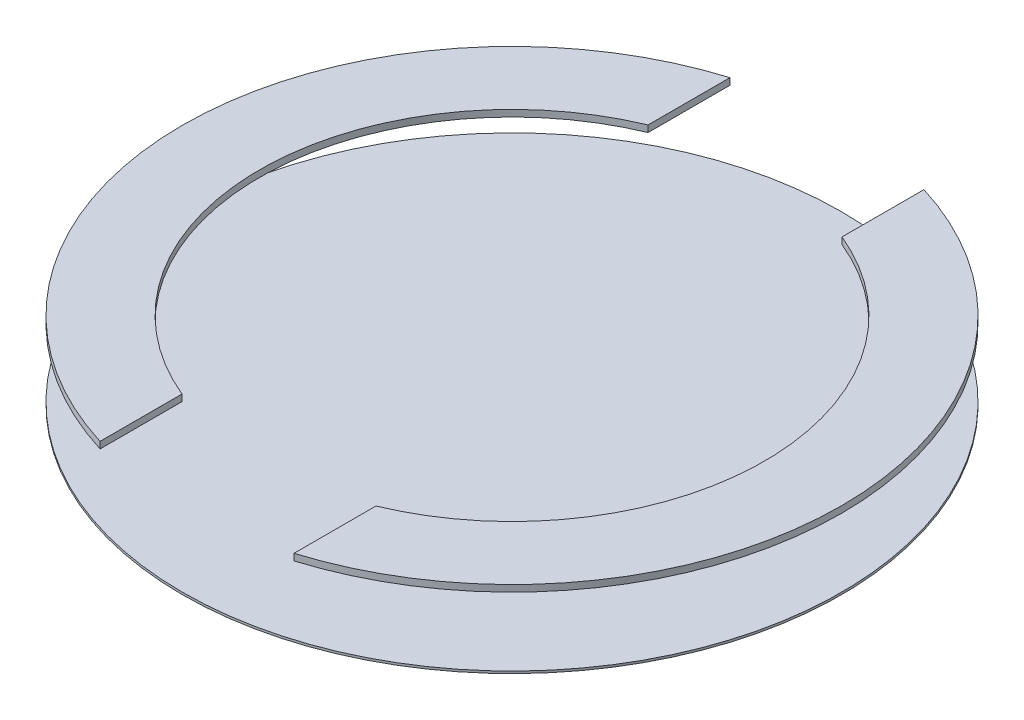
ISO-10303-21;
HEADER;
FILE_DESCRIPTION(('STEP AP214'),'2;1');
FILE_NAME('part.step','',(''),(''),'','','');
FILE_SCHEMA(('AUTOMOTIVE_DESIGN { 1 0 10303 214 1 1 1 1 }'));
ENDSEC;
DATA;
#1=APPLICATION_CONTEXT('core data for automotive mechanical design processes');
#2=APPLICATION_PROTOCOL_DEFINITION('international standard','automotive_design',2000,#1);
#3=PRODUCT_CONTEXT('',#1,'mechanical');
#4=PRODUCT('Part','Part','',(#3));
#5=PRODUCT_RELATED_PRODUCT_CATEGORY('part','',(#4));
#6=PRODUCT_DEFINITION_FORMATION('','',#4);
#7=PRODUCT_DEFINITION_CONTEXT('part definition',#1,'design');
#8=PRODUCT_DEFINITION('design','',#6,#7);
#9=PRODUCT_DEFINITION_SHAPE('','',#8);
#10=(LENGTH_UNIT() NAMED_UNIT(*) SI_UNIT(.MILLI.,.METRE.));
#11=(NAMED_UNIT(*) PLANE_ANGLE_UNIT() SI_UNIT($,.RADIAN.));
#12=(NAMED_UNIT(*) SI_UNIT($,.STERADIAN.) SOLID_ANGLE_UNIT());
#13=UNCERTAINTY_MEASURE_WITH_UNIT(LENGTH_MEASURE(1.E-05),#10,'distance_accuracy_value','');
#14=(GEOMETRIC_REPRESENTATION_CONTEXT(3) GLOBAL_UNCERTAINTY_ASSIGNED_CONTEXT((#13)) GLOBAL_UNIT_ASSIGNED_CONTEXT((#10,
#11,#12)) REPRESENTATION_CONTEXT('',''));
#15=CARTESIAN_POINT('',(0.,0.,0.));
#16=DIRECTION('',(0.,0.,1.));
#17=DIRECTION('',(1.,0.,0.));
#18=AXIS2_PLACEMENT_3D('',#15,#16,#17);
#19=CARTESIAN_POINT('',(440.104013269853,650.,0.));
#20=DIRECTION('',(-1.,0.,0.));
#21=DIRECTION('',(0.,0.,1.));
#22=AXIS2_PLACEMENT_3D('',#19,#20,#21);
#23=PLANE('',#22);
#24=DIRECTION('',(0.,-1.,0.));
#25=VECTOR('',#24,1.);
#26=CARTESIAN_POINT('',(440.104013269853,650.,-1429.31744168459));
#27=LINE('',#26,#25);
#28=CARTESIAN_POINT('',(440.104013269853,340.,-1429.31744168459));
#29=VERTEX_POINT('',#28);
#30=CARTESIAN_POINT('',(440.104013269853,310.,-1429.31744168459));
#31=VERTEX_POINT('',#30);
#32=EDGE_CURVE('E102',#29,#31,#27,.T.);
#33=ORIENTED_EDGE('',*,*,#32,.T.);
#34=DIRECTION('',(0.,0.,1.));
#35=VECTOR('',#34,1.);
#36=CARTESIAN_POINT('',(440.104013269853,310.,0.));
#37=LINE('',#36,#35);
#38=CARTESIAN_POINT('',(440.104013269853,310.,-1057.50647553573));
#39=VERTEX_POINT('',#38);
#40=EDGE_CURVE('E63',#31,#39,#37,.T.);
#41=ORIENTED_EDGE('',*,*,#40,.T.);
#42=DIRECTION('',(0.,-1.,0.));
#43=VECTOR('',#42,1.);
#44=CARTESIAN_POINT('',(440.104013269853,650.,-1057.50647553573));
#45=LINE('',#44,#43);
#46=CARTESIAN_POINT('',(440.104013269853,340.,-1057.50647553573));
#47=VERTEX_POINT('',#46);
#48=EDGE_CURVE('E95',#47,#39,#45,.T.);
#49=ORIENTED_EDGE('',*,*,#48,.F.);
#50=DIRECTION('',(0.,0.,1.));
#51=VECTOR('',#50,1.);
#52=CARTESIAN_POINT('',(440.104013269853,340.,0.));
#53=LINE('',#52,#51);
#54=EDGE_CURVE('E105',#29,#47,#53,.T.);
#55=ORIENTED_EDGE('',*,*,#54,.F.);
#56=EDGE_LOOP('',(#33,#41,#49,#55));
#57=FACE_BOUND('',#56,.T.);
#58=ADVANCED_FACE('F46',(#57),#23,.T.);
#59=CARTESIAN_POINT('',(0.,650.,0.));
#60=DIRECTION('',(0.,-1.,0.));
#61=DIRECTION('',(0.,0.,-1.));
#62=AXIS2_PLACEMENT_3D('',#59,#60,#61);
#63=CYLINDRICAL_SURFACE('',#62,1145.43069990997);
#64=CARTESIAN_POINT('',(0.,310.,0.));
#65=DIRECTION('',(0.,-1.,0.));
#66=DIRECTION('',(0.,0.,-1.));
#67=AXIS2_PLACEMENT_3D('',#64,#65,#66);
#68=CIRCLE('',#67,1145.43069990997);
#69=CARTESIAN_POINT('',(440.104013269853,310.,1057.50647553573));
#70=VERTEX_POINT('',#69);
#71=EDGE_CURVE('E12',#70,#39,#68,.F.);
#72=ORIENTED_EDGE('',*,*,#71,.F.);
#73=DIRECTION('',(0.,-1.,0.));
#74=VECTOR('',#73,1.);
#75=CARTESIAN_POINT('',(440.104013269853,650.,1057.50647553573));
#76=LINE('',#75,#74);
#77=CARTESIAN_POINT('',(440.104013269853,340.,1057.50647553573));
#78=VERTEX_POINT('',#77);
#79=EDGE_CURVE('E94',#78,#70,#76,.T.);
#80=ORIENTED_EDGE('',*,*,#79,.F.);
#81=CARTESIAN_POINT('',(0.,340.,0.));
#82=DIRECTION('',(0.,-1.,0.));
#83=DIRECTION('',(0.,0.,-1.));
#84=AXIS2_PLACEMENT_3D('',#81,#82,#83);
#85=CIRCLE('',#84,1145.43069990997);
#86=EDGE_CURVE('E89',#78,#47,#85,.F.);
#87=ORIENTED_EDGE('',*,*,#86,.T.);
#88=ORIENTED_EDGE('',*,*,#48,.T.);
#89=EDGE_LOOP('',(#72,#80,#87,#88));
#90=FACE_BOUND('',#89,.T.);
#91=ADVANCED_FACE('F120',(#90),#63,.F.);
#92=CARTESIAN_POINT('',(440.104013269853,650.,0.));
#93=DIRECTION('',(1.,0.,0.));
#94=DIRECTION('',(0.,0.,-1.));
#95=AXIS2_PLACEMENT_3D('',#92,#93,#94);
#96=PLANE('',#95);
#97=DIRECTION('',(0.,0.,-1.));
#98=VECTOR('',#97,1.);
#99=CARTESIAN_POINT('',(440.104013269853,310.,0.));
#100=LINE('',#99,#98);
#101=CARTESIAN_POINT('',(440.104013269853,310.,1429.31744168459));
#102=VERTEX_POINT('',#101);
#103=EDGE_CURVE('E56',#102,#70,#100,.T.);
#104=ORIENTED_EDGE('',*,*,#103,.F.);
#105=DIRECTION('',(0.,-1.,0.));
#106=VECTOR('',#105,1.);
#107=CARTESIAN_POINT('',(440.104013269853,650.,1429.31744168459));
#108=LINE('',#107,#106);
#109=CARTESIAN_POINT('',(440.104013269853,340.,1429.31744168459));
#110=VERTEX_POINT('',#109);
#111=EDGE_CURVE('E100',#110,#102,#108,.T.);
#112=ORIENTED_EDGE('',*,*,#111,.F.);
#113=DIRECTION('',(0.,0.,-1.));
#114=VECTOR('',#113,1.);
#115=CARTESIAN_POINT('',(440.104013269853,340.,0.));
#116=LINE('',#115,#114);
#117=EDGE_CURVE('E83',#110,#78,#116,.T.);
#118=ORIENTED_EDGE('',*,*,#117,.T.);
#119=ORIENTED_EDGE('',*,*,#79,.T.);
#120=EDGE_LOOP('',(#104,#112,#118,#119));
#121=FACE_BOUND('',#120,.T.);
#122=ADVANCED_FACE('F104',(#121),#96,.F.);
#123=CARTESIAN_POINT('',(0.,650.,0.));
#124=DIRECTION('',(0.,-1.,0.));
#125=DIRECTION('',(0.,0.,-1.));
#126=AXIS2_PLACEMENT_3D('',#123,#124,#125);
#127=CYLINDRICAL_SURFACE('',#126,1495.54);
#128=CARTESIAN_POINT('',(0.,310.,0.));
#129=DIRECTION('',(0.,-1.,0.));
#130=DIRECTION('',(0.,0.,-1.));
#131=AXIS2_PLACEMENT_3D('',#128,#129,#130);
#132=CIRCLE('',#131,1495.54);
#133=EDGE_CURVE('E50',#31,#102,#132,.T.);
#134=ORIENTED_EDGE('',*,*,#133,.F.);
#135=ORIENTED_EDGE('',*,*,#32,.F.);
#136=CARTESIAN_POINT('',(0.,340.,0.));
#137=DIRECTION('',(0.,-1.,0.));
#138=DIRECTION('',(0.,0.,-1.));
#139=AXIS2_PLACEMENT_3D('',#136,#137,#138);
#140=CIRCLE('',#139,1495.54);
#141=EDGE_CURVE('E86',#29,#110,#140,.T.);
#142=ORIENTED_EDGE('',*,*,#141,.T.);
#143=ORIENTED_EDGE('',*,*,#111,.T.);
#144=EDGE_LOOP('',(#134,#135,#142,#143));
#145=FACE_BOUND('',#144,.T.);
#146=ADVANCED_FACE('F48',(#145),#127,.T.);
#147=CARTESIAN_POINT('',(-1495.54,340.,-1495.54));
#148=DIRECTION('',(0.,-1.,0.));
#149=DIRECTION('',(0.,0.,-1.));
#150=AXIS2_PLACEMENT_3D('',#147,#148,#149);
#151=PLANE('',#150);
#152=ORIENTED_EDGE('',*,*,#54,.T.);
#153=ORIENTED_EDGE('',*,*,#86,.F.);
#154=ORIENTED_EDGE('',*,*,#117,.F.);
#155=ORIENTED_EDGE('',*,*,#141,.F.);
#156=EDGE_LOOP('',(#152,#153,#154,#155));
#157=FACE_BOUND('',#156,.T.);
#158=ADVANCED_FACE('F85',(#157),#151,.F.);
#159=CARTESIAN_POINT('',(-1495.54,310.,-1495.54));
#160=DIRECTION('',(0.,-1.,0.));
#161=DIRECTION('',(0.,0.,-1.));
#162=AXIS2_PLACEMENT_3D('',#159,#160,#161);
#163=PLANE('',#162);
#164=ORIENTED_EDGE('',*,*,#133,.T.);
#165=ORIENTED_EDGE('',*,*,#103,.T.);
#166=ORIENTED_EDGE('',*,*,#71,.T.);
#167=ORIENTED_EDGE('',*,*,#40,.F.);
#168=EDGE_LOOP('',(#164,#165,#166,#167));
#169=FACE_BOUND('',#168,.T.);
#170=ADVANCED_FACE('F115',(#169),#163,.T.);
#171=CLOSED_SHELL('',(#58,#91,#122,#146,#158,#170));
#172=MANIFOLD_SOLID_BREP('B2',#171);
#173=CARTESIAN_POINT('',(0.,-10.,0.));
#174=DIRECTION('',(0.,-1.,0.));
#175=DIRECTION('',(0.,0.,-1.));
#176=AXIS2_PLACEMENT_3D('',#173,#174,#175);
#177=PLANE('',#176);
#178=CARTESIAN_POINT('',(0.,-10.,0.));
#179=DIRECTION('',(0.,-1.,0.));
#180=DIRECTION('',(0.,0.,-1.));
#181=AXIS2_PLACEMENT_3D('',#178,#179,#180);
#182=CIRCLE('',#181,1495.54);
#183=CARTESIAN_POINT('',(0.,-10.,-1495.54));
#184=VERTEX_POINT('',#183);
#185=EDGE_CURVE('E189',#184,#184,#182,.T.);
#186=ORIENTED_EDGE('',*,*,#185,.T.);
#187=EDGE_LOOP('',(#186));
#188=FACE_BOUND('',#187,.T.);
#189=ADVANCED_FACE('F185',(#188),#177,.T.);
#190=CARTESIAN_POINT('',(0.,0.,0.));
#191=DIRECTION('',(0.,-1.,0.));
#192=DIRECTION('',(0.,0.,-1.));
#193=AXIS2_PLACEMENT_3D('',#190,#191,#192);
#194=PLANE('',#193);
#195=CARTESIAN_POINT('',(0.,0.,0.));
#196=DIRECTION('',(0.,-1.,0.));
#197=DIRECTION('',(0.,0.,-1.));
#198=AXIS2_PLACEMENT_3D('',#195,#196,#197);
#199=CIRCLE('',#198,1495.54);
#200=CARTESIAN_POINT('',(0.,0.,-1495.54));
#201=VERTEX_POINT('',#200);
#202=EDGE_CURVE('E45',#201,#201,#199,.T.);
#203=ORIENTED_EDGE('',*,*,#202,.F.);
#204=EDGE_LOOP('',(#203));
#205=FACE_BOUND('',#204,.T.);
#206=ADVANCED_FACE('F200',(#205),#194,.F.);
#207=CARTESIAN_POINT('',(0.,650.,0.));
#208=DIRECTION('',(0.,-1.,0.));
#209=DIRECTION('',(0.,0.,-1.));
#210=AXIS2_PLACEMENT_3D('',#207,#208,#209);
#211=CYLINDRICAL_SURFACE('',#210,1495.54);
#212=ORIENTED_EDGE('',*,*,#185,.F.);
#213=EDGE_LOOP('',(#212));
#214=FACE_BOUND('',#213,.T.);
#215=ORIENTED_EDGE('',*,*,#202,.T.);
#216=EDGE_LOOP('',(#215));
#217=FACE_BOUND('',#216,.T.);
#218=ADVANCED_FACE('F187',(#214,#217),#211,.T.);
#219=CLOSED_SHELL('',(#189,#206,#218));
#220=MANIFOLD_SOLID_BREP('B6',#219);
#221=CARTESIAN_POINT('',(-1495.54,340.,-1495.54));
#222=DIRECTION('',(0.,-1.,0.));
#223=DIRECTION('',(0.,0.,-1.));
#224=AXIS2_PLACEMENT_3D('',#221,#222,#223);
#225=PLANE('',#224);
#226=CARTESIAN_POINT('',(0.,340.,0.));
#227=DIRECTION('',(0.,-1.,0.));
#228=DIRECTION('',(0.,0.,-1.));
#229=AXIS2_PLACEMENT_3D('',#226,#227,#228);
#230=CIRCLE('',#229,1495.54);
#231=CARTESIAN_POINT('',(-440.104013269853,340.,1429.31744168459));
#232=VERTEX_POINT('',#231);
#233=CARTESIAN_POINT('',(-440.104013269853,340.,-1429.31744168459));
#234=VERTEX_POINT('',#233);
#235=EDGE_CURVE('E257',#232,#234,#230,.T.);
#236=ORIENTED_EDGE('',*,*,#235,.F.);
#237=DIRECTION('',(0.,0.,-1.));
#238=VECTOR('',#237,1.);
#239=CARTESIAN_POINT('',(-440.104013269853,340.,0.));
#240=LINE('',#239,#238);
#241=CARTESIAN_POINT('',(-440.104013269853,340.,1057.50647553573));
#242=VERTEX_POINT('',#241);
#243=EDGE_CURVE('E243',#232,#242,#240,.T.);
#244=ORIENTED_EDGE('',*,*,#243,.T.);
#245=CARTESIAN_POINT('',(0.,340.,0.));
#246=DIRECTION('',(0.,-1.,0.));
#247=DIRECTION('',(0.,0.,-1.));
#248=AXIS2_PLACEMENT_3D('',#245,#246,#247);
#249=CIRCLE('',#248,1145.43069990997);
#250=CARTESIAN_POINT('',(-440.104013269853,340.,-1057.50647553573));
#251=VERTEX_POINT('',#250);
#252=EDGE_CURVE('E282',#242,#251,#249,.T.);
#253=ORIENTED_EDGE('',*,*,#252,.T.);
#254=DIRECTION('',(0.,0.,1.));
#255=VECTOR('',#254,1.);
#256=CARTESIAN_POINT('',(-440.104013269853,340.,0.));
#257=LINE('',#256,#255);
#258=EDGE_CURVE('E294',#234,#251,#257,.T.);
#259=ORIENTED_EDGE('',*,*,#258,.F.);
#260=EDGE_LOOP('',(#236,#244,#253,#259));
#261=FACE_BOUND('',#260,.T.);
#262=ADVANCED_FACE('F235',(#261),#225,.F.);
#263=CARTESIAN_POINT('',(-440.104013269853,650.,0.));
#264=DIRECTION('',(-1.,0.,0.));
#265=DIRECTION('',(0.,0.,1.));
#266=AXIS2_PLACEMENT_3D('',#263,#264,#265);
#267=PLANE('',#266);
#268=DIRECTION('',(0.,0.,1.));
#269=VECTOR('',#268,1.);
#270=CARTESIAN_POINT('',(-440.104013269853,310.,0.));
#271=LINE('',#270,#269);
#272=CARTESIAN_POINT('',(-440.104013269853,310.,-1429.31744168459));
#273=VERTEX_POINT('',#272);
#274=CARTESIAN_POINT('',(-440.104013269853,310.,-1057.50647553573));
#275=VERTEX_POINT('',#274);
#276=EDGE_CURVE('E283',#273,#275,#271,.T.);
#277=ORIENTED_EDGE('',*,*,#276,.F.);
#278=DIRECTION('',(0.,-1.,0.));
#279=VECTOR('',#278,1.);
#280=CARTESIAN_POINT('',(-440.104013269853,650.,-1429.31744168459));
#281=LINE('',#280,#279);
#282=EDGE_CURVE('E280',#234,#273,#281,.T.);
#283=ORIENTED_EDGE('',*,*,#282,.F.);
#284=ORIENTED_EDGE('',*,*,#258,.T.);
#285=DIRECTION('',(0.,-1.,0.));
#286=VECTOR('',#285,1.);
#287=CARTESIAN_POINT('',(-440.104013269853,650.,-1057.50647553573));
#288=LINE('',#287,#286);
#289=EDGE_CURVE('E292',#251,#275,#288,.T.);
#290=ORIENTED_EDGE('',*,*,#289,.T.);
#291=EDGE_LOOP('',(#277,#283,#284,#290));
#292=FACE_BOUND('',#291,.T.);
#293=ADVANCED_FACE('F308',(#292),#267,.F.);
#294=CARTESIAN_POINT('',(-440.104013269853,650.,0.));
#295=DIRECTION('',(1.,0.,0.));
#296=DIRECTION('',(0.,0.,-1.));
#297=AXIS2_PLACEMENT_3D('',#294,#295,#296);
#298=PLANE('',#297);
#299=DIRECTION('',(0.,-1.,0.));
#300=VECTOR('',#299,1.);
#301=CARTESIAN_POINT('',(-440.104013269853,650.,1429.31744168459));
#302=LINE('',#301,#300);
#303=CARTESIAN_POINT('',(-440.104013269853,310.,1429.31744168459));
#304=VERTEX_POINT('',#303);
#305=EDGE_CURVE('E278',#232,#304,#302,.T.);
#306=ORIENTED_EDGE('',*,*,#305,.T.);
#307=DIRECTION('',(0.,0.,-1.));
#308=VECTOR('',#307,1.);
#309=CARTESIAN_POINT('',(-440.104013269853,310.,0.));
#310=LINE('',#309,#308);
#311=CARTESIAN_POINT('',(-440.104013269853,310.,1057.50647553573));
#312=VERTEX_POINT('',#311);
#313=EDGE_CURVE('E183',#304,#312,#310,.T.);
#314=ORIENTED_EDGE('',*,*,#313,.T.);
#315=DIRECTION('',(0.,-1.,0.));
#316=VECTOR('',#315,1.);
#317=CARTESIAN_POINT('',(-440.104013269853,650.,1057.50647553573));
#318=LINE('',#317,#316);
#319=EDGE_CURVE('E290',#242,#312,#318,.T.);
#320=ORIENTED_EDGE('',*,*,#319,.F.);
#321=ORIENTED_EDGE('',*,*,#243,.F.);
#322=EDGE_LOOP('',(#306,#314,#320,#321));
#323=FACE_BOUND('',#322,.T.);
#324=ADVANCED_FACE('F289',(#323),#298,.T.);
#325=CARTESIAN_POINT('',(0.,650.,0.));
#326=DIRECTION('',(0.,-1.,0.));
#327=DIRECTION('',(0.,0.,-1.));
#328=AXIS2_PLACEMENT_3D('',#325,#326,#327);
#329=CYLINDRICAL_SURFACE('',#328,1145.43069990997);
#330=ORIENTED_EDGE('',*,*,#319,.T.);
#331=CARTESIAN_POINT('',(0.,310.,0.));
#332=DIRECTION('',(0.,-1.,0.));
#333=DIRECTION('',(0.,0.,-1.));
#334=AXIS2_PLACEMENT_3D('',#331,#332,#333);
#335=CIRCLE('',#334,1145.43069990997);
#336=EDGE_CURVE('E250',#312,#275,#335,.T.);
#337=ORIENTED_EDGE('',*,*,#336,.T.);
#338=ORIENTED_EDGE('',*,*,#289,.F.);
#339=ORIENTED_EDGE('',*,*,#252,.F.);
#340=EDGE_LOOP('',(#330,#337,#338,#339));
#341=FACE_BOUND('',#340,.T.);
#342=ADVANCED_FACE('F303',(#341),#329,.F.);
#343=CARTESIAN_POINT('',(0.,650.,0.));
#344=DIRECTION('',(0.,-1.,0.));
#345=DIRECTION('',(0.,0.,-1.));
#346=AXIS2_PLACEMENT_3D('',#343,#344,#345);
#347=CYLINDRICAL_SURFACE('',#346,1495.54);
#348=CARTESIAN_POINT('',(0.,310.,0.));
#349=DIRECTION('',(0.,-1.,0.));
#350=DIRECTION('',(0.,0.,-1.));
#351=AXIS2_PLACEMENT_3D('',#348,#349,#350);
#352=CIRCLE('',#351,1495.54);
#353=EDGE_CURVE('E276',#304,#273,#352,.T.);
#354=ORIENTED_EDGE('',*,*,#353,.F.);
#355=ORIENTED_EDGE('',*,*,#305,.F.);
#356=ORIENTED_EDGE('',*,*,#235,.T.);
#357=ORIENTED_EDGE('',*,*,#282,.T.);
#358=EDGE_LOOP('',(#354,#355,#356,#357));
#359=FACE_BOUND('',#358,.T.);
#360=ADVANCED_FACE('F237',(#359),#347,.T.);
#361=CARTESIAN_POINT('',(-1495.54,310.,-1495.54));
#362=DIRECTION('',(0.,-1.,0.));
#363=DIRECTION('',(0.,0.,-1.));
#364=AXIS2_PLACEMENT_3D('',#361,#362,#363);
#365=PLANE('',#364);
#366=ORIENTED_EDGE('',*,*,#353,.T.);
#367=ORIENTED_EDGE('',*,*,#276,.T.);
#368=ORIENTED_EDGE('',*,*,#336,.F.);
#369=ORIENTED_EDGE('',*,*,#313,.F.);
#370=EDGE_LOOP('',(#366,#367,#368,#369));
#371=FACE_BOUND('',#370,.T.);
#372=ADVANCED_FACE('F285',(#371),#365,.T.);
#373=CLOSED_SHELL('',(#262,#293,#324,#342,#360,#372));
#374=MANIFOLD_SOLID_BREP('B40',#373);
#375=ADVANCED_BREP_SHAPE_REPRESENTATION('',(#18,#172,#220,#374),#14);
#376=SHAPE_DEFINITION_REPRESENTATION(#9,#375);
ENDSEC;
END-ISO-10303-21;
